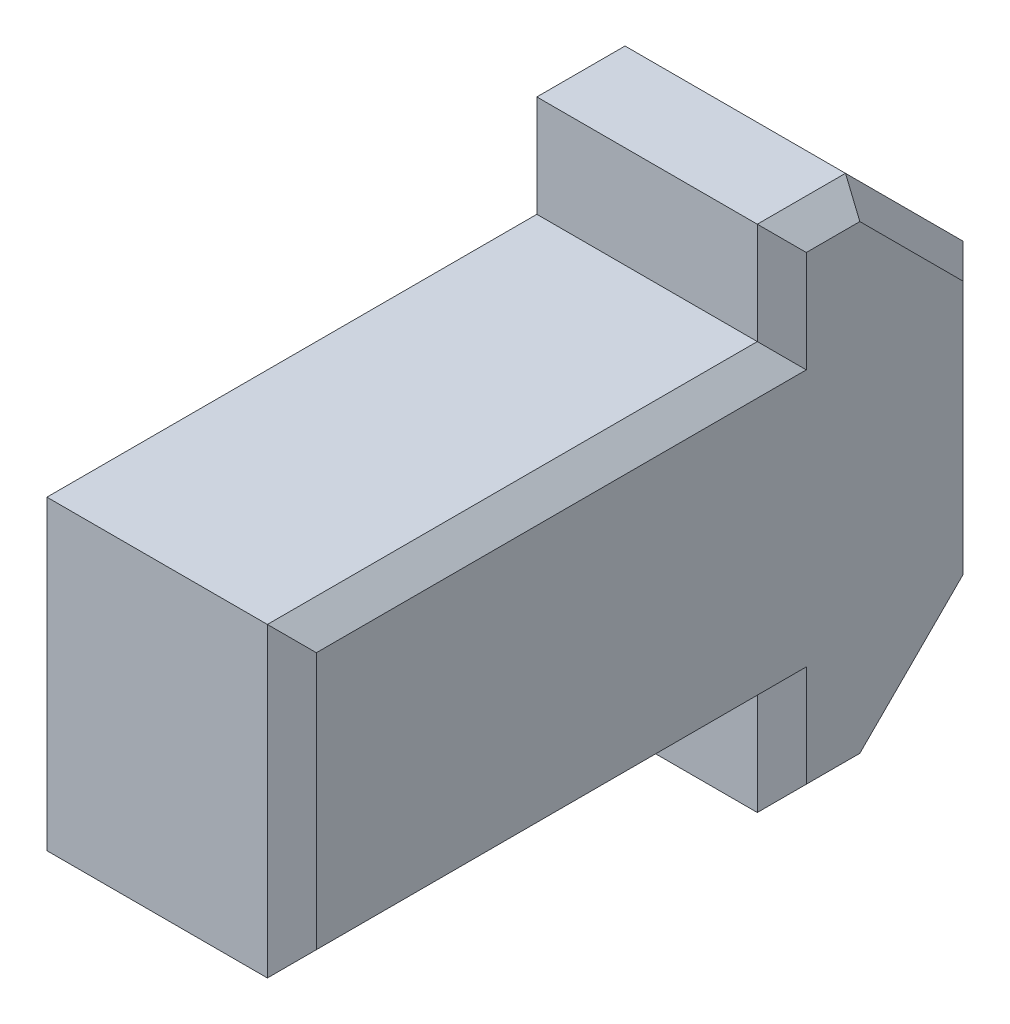
ISO-10303-21;
HEADER;
FILE_DESCRIPTION(('STEP AP214'),'2;1');
FILE_NAME('part.step','',(''),(''),'','','');
FILE_SCHEMA(('AUTOMOTIVE_DESIGN { 1 0 10303 214 1 1 1 1 }'));
ENDSEC;
DATA;
#1=APPLICATION_CONTEXT('core data for automotive mechanical design processes');
#2=APPLICATION_PROTOCOL_DEFINITION('international standard','automotive_design',2000,#1);
#3=PRODUCT_CONTEXT('',#1,'mechanical');
#4=PRODUCT('Part','Part','',(#3));
#5=PRODUCT_RELATED_PRODUCT_CATEGORY('part','',(#4));
#6=PRODUCT_DEFINITION_FORMATION('','',#4);
#7=PRODUCT_DEFINITION_CONTEXT('part definition',#1,'design');
#8=PRODUCT_DEFINITION('design','',#6,#7);
#9=PRODUCT_DEFINITION_SHAPE('','',#8);
#10=(LENGTH_UNIT() NAMED_UNIT(*) SI_UNIT(.MILLI.,.METRE.));
#11=(NAMED_UNIT(*) PLANE_ANGLE_UNIT() SI_UNIT($,.RADIAN.));
#12=(NAMED_UNIT(*) SI_UNIT($,.STERADIAN.) SOLID_ANGLE_UNIT());
#13=UNCERTAINTY_MEASURE_WITH_UNIT(LENGTH_MEASURE(1.E-05),#10,'distance_accuracy_value','');
#14=(GEOMETRIC_REPRESENTATION_CONTEXT(3) GLOBAL_UNCERTAINTY_ASSIGNED_CONTEXT((#13)) GLOBAL_UNIT_ASSIGNED_CONTEXT((#10,
#11,#12)) REPRESENTATION_CONTEXT('',''));
#15=CARTESIAN_POINT('',(0.,0.,0.));
#16=DIRECTION('',(0.,0.,1.));
#17=DIRECTION('',(1.,0.,0.));
#18=AXIS2_PLACEMENT_3D('',#15,#16,#17);
#19=CARTESIAN_POINT('',(5.,3.125,4.2));
#20=DIRECTION('',(0.,0.,-1.));
#21=DIRECTION('',(-1.,0.,0.));
#22=AXIS2_PLACEMENT_3D('',#19,#20,#21);
#23=PLANE('',#22);
#24=DIRECTION('',(-1.,0.,0.));
#25=VECTOR('',#24,1.);
#26=CARTESIAN_POINT('',(5.,3.125,4.2));
#27=LINE('',#26,#25);
#28=CARTESIAN_POINT('',(4.5,3.125,4.2));
#29=VERTEX_POINT('',#28);
#30=CARTESIAN_POINT('',(0.,3.125,4.2));
#31=VERTEX_POINT('',#30);
#32=EDGE_CURVE('E149',#29,#31,#27,.T.);
#33=ORIENTED_EDGE('',*,*,#32,.F.);
#34=DIRECTION('',(0.,1.,0.));
#35=VECTOR('',#34,1.);
#36=CARTESIAN_POINT('',(4.5,3.125,4.2));
#37=LINE('',#36,#35);
#38=CARTESIAN_POINT('',(4.5,5.2,4.2));
#39=VERTEX_POINT('',#38);
#40=EDGE_CURVE('E11',#29,#39,#37,.T.);
#41=ORIENTED_EDGE('',*,*,#40,.T.);
#42=DIRECTION('',(-1.,0.,0.));
#43=VECTOR('',#42,1.);
#44=CARTESIAN_POINT('',(5.,5.2,4.2));
#45=LINE('',#44,#43);
#46=CARTESIAN_POINT('',(0.,5.2,4.2));
#47=VERTEX_POINT('',#46);
#48=EDGE_CURVE('E172',#39,#47,#45,.T.);
#49=ORIENTED_EDGE('',*,*,#48,.T.);
#50=DIRECTION('',(0.,-1.,0.));
#51=VECTOR('',#50,1.);
#52=CARTESIAN_POINT('',(0.,3.125,4.2));
#53=LINE('',#52,#51);
#54=EDGE_CURVE('E165',#47,#31,#53,.T.);
#55=ORIENTED_EDGE('',*,*,#54,.T.);
#56=EDGE_LOOP('',(#33,#41,#49,#55));
#57=FACE_BOUND('',#56,.T.);
#58=ADVANCED_FACE('F41',(#57),#23,.F.);
#59=CARTESIAN_POINT('',(5.,3.125,4.2));
#60=DIRECTION('',(0.,-1.,0.));
#61=DIRECTION('',(0.,0.,-1.));
#62=AXIS2_PLACEMENT_3D('',#59,#60,#61);
#63=PLANE('',#62);
#64=DIRECTION('',(-1.,0.,0.));
#65=VECTOR('',#64,1.);
#66=CARTESIAN_POINT('',(5.,3.125,14.2));
#67=LINE('',#66,#65);
#68=CARTESIAN_POINT('',(4.5,3.125,14.2));
#69=VERTEX_POINT('',#68);
#70=CARTESIAN_POINT('',(0.,3.125,14.2));
#71=VERTEX_POINT('',#70);
#72=EDGE_CURVE('E159',#69,#71,#67,.T.);
#73=ORIENTED_EDGE('',*,*,#72,.F.);
#74=DIRECTION('',(0.,0.,-1.));
#75=VECTOR('',#74,1.);
#76=CARTESIAN_POINT('',(4.5,3.125,4.2));
#77=LINE('',#76,#75);
#78=EDGE_CURVE('E52',#69,#29,#77,.T.);
#79=ORIENTED_EDGE('',*,*,#78,.T.);
#80=ORIENTED_EDGE('',*,*,#32,.T.);
#81=DIRECTION('',(0.,0.,1.));
#82=VECTOR('',#81,1.);
#83=CARTESIAN_POINT('',(0.,3.125,4.2));
#84=LINE('',#83,#82);
#85=EDGE_CURVE('E152',#31,#71,#84,.T.);
#86=ORIENTED_EDGE('',*,*,#85,.T.);
#87=EDGE_LOOP('',(#73,#79,#80,#86));
#88=FACE_BOUND('',#87,.T.);
#89=ADVANCED_FACE('F151',(#88),#63,.F.);
#90=CARTESIAN_POINT('',(5.,3.125,14.2));
#91=DIRECTION('',(0.,0.,-1.));
#92=DIRECTION('',(-1.,0.,0.));
#93=AXIS2_PLACEMENT_3D('',#90,#91,#92);
#94=PLANE('',#93);
#95=DIRECTION('',(-1.,0.,0.));
#96=VECTOR('',#95,1.);
#97=CARTESIAN_POINT('',(5.,-3.125,14.2));
#98=LINE('',#97,#96);
#99=CARTESIAN_POINT('',(4.5,-3.125,14.2));
#100=VERTEX_POINT('',#99);
#101=CARTESIAN_POINT('',(0.,-3.125,14.2));
#102=VERTEX_POINT('',#101);
#103=EDGE_CURVE('E229',#100,#102,#98,.T.);
#104=ORIENTED_EDGE('',*,*,#103,.F.);
#105=DIRECTION('',(0.,1.,0.));
#106=VECTOR('',#105,1.);
#107=CARTESIAN_POINT('',(4.5,3.125,14.2));
#108=LINE('',#107,#106);
#109=EDGE_CURVE('E67',#100,#69,#108,.T.);
#110=ORIENTED_EDGE('',*,*,#109,.T.);
#111=ORIENTED_EDGE('',*,*,#72,.T.);
#112=DIRECTION('',(0.,-1.,0.));
#113=VECTOR('',#112,1.);
#114=CARTESIAN_POINT('',(0.,3.125,14.2));
#115=LINE('',#114,#113);
#116=EDGE_CURVE('E168',#71,#102,#115,.T.);
#117=ORIENTED_EDGE('',*,*,#116,.T.);
#118=EDGE_LOOP('',(#104,#110,#111,#117));
#119=FACE_BOUND('',#118,.T.);
#120=ADVANCED_FACE('F400',(#119),#94,.F.);
#121=CARTESIAN_POINT('',(5.,-3.125,14.2));
#122=DIRECTION('',(0.,1.,0.));
#123=DIRECTION('',(0.,0.,1.));
#124=AXIS2_PLACEMENT_3D('',#121,#122,#123);
#125=PLANE('',#124);
#126=DIRECTION('',(-1.,0.,0.));
#127=VECTOR('',#126,1.);
#128=CARTESIAN_POINT('',(5.,-3.125,4.2));
#129=LINE('',#128,#127);
#130=CARTESIAN_POINT('',(4.5,-3.125,4.2));
#131=VERTEX_POINT('',#130);
#132=CARTESIAN_POINT('',(0.,-3.125,4.2));
#133=VERTEX_POINT('',#132);
#134=EDGE_CURVE('E226',#131,#133,#129,.T.);
#135=ORIENTED_EDGE('',*,*,#134,.F.);
#136=DIRECTION('',(0.,0.,1.));
#137=VECTOR('',#136,1.);
#138=CARTESIAN_POINT('',(4.5,-3.125,14.2));
#139=LINE('',#138,#137);
#140=EDGE_CURVE('E283',#131,#100,#139,.T.);
#141=ORIENTED_EDGE('',*,*,#140,.T.);
#142=ORIENTED_EDGE('',*,*,#103,.T.);
#143=DIRECTION('',(0.,0.,-1.));
#144=VECTOR('',#143,1.);
#145=CARTESIAN_POINT('',(0.,-3.125,14.2));
#146=LINE('',#145,#144);
#147=EDGE_CURVE('E182',#102,#133,#146,.T.);
#148=ORIENTED_EDGE('',*,*,#147,.T.);
#149=EDGE_LOOP('',(#135,#141,#142,#148));
#150=FACE_BOUND('',#149,.T.);
#151=ADVANCED_FACE('F558',(#150),#125,.F.);
#152=CARTESIAN_POINT('',(5.,-3.125,4.2));
#153=DIRECTION('',(0.,0.,-1.));
#154=DIRECTION('',(-1.,0.,0.));
#155=AXIS2_PLACEMENT_3D('',#152,#153,#154);
#156=PLANE('',#155);
#157=DIRECTION('',(-1.,0.,0.));
#158=VECTOR('',#157,1.);
#159=CARTESIAN_POINT('',(5.,-5.2,4.2));
#160=LINE('',#159,#158);
#161=CARTESIAN_POINT('',(4.5,-5.2,4.2));
#162=VERTEX_POINT('',#161);
#163=CARTESIAN_POINT('',(0.,-5.2,4.2));
#164=VERTEX_POINT('',#163);
#165=EDGE_CURVE('E223',#162,#164,#160,.T.);
#166=ORIENTED_EDGE('',*,*,#165,.F.);
#167=DIRECTION('',(0.,1.,0.));
#168=VECTOR('',#167,1.);
#169=CARTESIAN_POINT('',(4.5,-3.125,4.2));
#170=LINE('',#169,#168);
#171=EDGE_CURVE('E280',#162,#131,#170,.T.);
#172=ORIENTED_EDGE('',*,*,#171,.T.);
#173=ORIENTED_EDGE('',*,*,#134,.T.);
#174=DIRECTION('',(0.,-1.,0.));
#175=VECTOR('',#174,1.);
#176=CARTESIAN_POINT('',(0.,-3.125,4.2));
#177=LINE('',#176,#175);
#178=EDGE_CURVE('E186',#133,#164,#177,.T.);
#179=ORIENTED_EDGE('',*,*,#178,.T.);
#180=EDGE_LOOP('',(#166,#172,#173,#179));
#181=FACE_BOUND('',#180,.T.);
#182=ADVANCED_FACE('F550',(#181),#156,.F.);
#183=CARTESIAN_POINT('',(5.,-5.2,4.2));
#184=DIRECTION('',(0.,1.,0.));
#185=DIRECTION('',(0.,0.,1.));
#186=AXIS2_PLACEMENT_3D('',#183,#184,#185);
#187=PLANE('',#186);
#188=DIRECTION('',(-1.,0.,0.));
#189=VECTOR('',#188,1.);
#190=CARTESIAN_POINT('',(5.,-5.2,2.4));
#191=LINE('',#190,#189);
#192=CARTESIAN_POINT('',(4.5,-5.2,2.4));
#193=VERTEX_POINT('',#192);
#194=CARTESIAN_POINT('',(0.,-5.2,2.4));
#195=VERTEX_POINT('',#194);
#196=EDGE_CURVE('E220',#193,#195,#191,.T.);
#197=ORIENTED_EDGE('',*,*,#196,.F.);
#198=DIRECTION('',(0.,0.,1.));
#199=VECTOR('',#198,1.);
#200=CARTESIAN_POINT('',(4.5,-5.2,4.2));
#201=LINE('',#200,#199);
#202=EDGE_CURVE('E277',#193,#162,#201,.T.);
#203=ORIENTED_EDGE('',*,*,#202,.T.);
#204=ORIENTED_EDGE('',*,*,#165,.T.);
#205=DIRECTION('',(0.,0.,-1.));
#206=VECTOR('',#205,1.);
#207=CARTESIAN_POINT('',(0.,-5.2,4.2));
#208=LINE('',#207,#206);
#209=EDGE_CURVE('E190',#164,#195,#208,.T.);
#210=ORIENTED_EDGE('',*,*,#209,.T.);
#211=EDGE_LOOP('',(#197,#203,#204,#210));
#212=FACE_BOUND('',#211,.T.);
#213=ADVANCED_FACE('F382',(#212),#187,.F.);
#214=CARTESIAN_POINT('',(5.,-5.2,2.4));
#215=DIRECTION('',(0.,0.707106781186548,0.707106781186548));
#216=DIRECTION('',(0.,-0.707106781186548,0.707106781186548));
#217=AXIS2_PLACEMENT_3D('',#214,#215,#216);
#218=PLANE('',#217);
#219=DIRECTION('',(-1.,0.,0.));
#220=VECTOR('',#219,1.);
#221=CARTESIAN_POINT('',(5.,-2.8,0.));
#222=LINE('',#221,#220);
#223=CARTESIAN_POINT('',(4.5,-2.8,0.));
#224=VERTEX_POINT('',#223);
#225=CARTESIAN_POINT('',(0.,-2.8,0.));
#226=VERTEX_POINT('',#225);
#227=EDGE_CURVE('E217',#224,#226,#222,.T.);
#228=ORIENTED_EDGE('',*,*,#227,.F.);
#229=DIRECTION('',(0.,-0.707106781186548,0.707106781186548));
#230=VECTOR('',#229,1.);
#231=CARTESIAN_POINT('',(4.5,-5.2,2.4));
#232=LINE('',#231,#230);
#233=EDGE_CURVE('E274',#224,#193,#232,.T.);
#234=ORIENTED_EDGE('',*,*,#233,.T.);
#235=ORIENTED_EDGE('',*,*,#196,.T.);
#236=DIRECTION('',(0.,0.707106781186547,-0.707106781186547));
#237=VECTOR('',#236,1.);
#238=CARTESIAN_POINT('',(0.,-5.2,2.4));
#239=LINE('',#238,#237);
#240=EDGE_CURVE('E194',#195,#226,#239,.T.);
#241=ORIENTED_EDGE('',*,*,#240,.T.);
#242=EDGE_LOOP('',(#228,#234,#235,#241));
#243=FACE_BOUND('',#242,.T.);
#244=ADVANCED_FACE('F379',(#243),#218,.F.);
#245=CARTESIAN_POINT('',(5.,2.8,0.));
#246=DIRECTION('',(0.,0.,1.));
#247=DIRECTION('',(0.,-1.,0.));
#248=AXIS2_PLACEMENT_3D('',#245,#246,#247);
#249=PLANE('',#248);
#250=DIRECTION('',(-1.,0.,0.));
#251=VECTOR('',#250,1.);
#252=CARTESIAN_POINT('',(5.,2.8,0.));
#253=LINE('',#252,#251);
#254=CARTESIAN_POINT('',(4.5,2.8,0.));
#255=VERTEX_POINT('',#254);
#256=CARTESIAN_POINT('',(0.,2.8,0.));
#257=VERTEX_POINT('',#256);
#258=EDGE_CURVE('E214',#255,#257,#253,.T.);
#259=ORIENTED_EDGE('',*,*,#258,.F.);
#260=DIRECTION('',(0.,-1.,0.));
#261=VECTOR('',#260,1.);
#262=CARTESIAN_POINT('',(4.5,2.8,0.));
#263=LINE('',#262,#261);
#264=EDGE_CURVE('E271',#255,#224,#263,.T.);
#265=ORIENTED_EDGE('',*,*,#264,.T.);
#266=ORIENTED_EDGE('',*,*,#227,.T.);
#267=DIRECTION('',(0.,1.,0.));
#268=VECTOR('',#267,1.);
#269=CARTESIAN_POINT('',(0.,2.8,0.));
#270=LINE('',#269,#268);
#271=EDGE_CURVE('E198',#226,#257,#270,.T.);
#272=ORIENTED_EDGE('',*,*,#271,.T.);
#273=EDGE_LOOP('',(#259,#265,#266,#272));
#274=FACE_BOUND('',#273,.T.);
#275=ADVANCED_FACE('F365',(#274),#249,.F.);
#276=CARTESIAN_POINT('',(5.,5.2,2.4));
#277=DIRECTION('',(0.,-0.707106781186548,0.707106781186547));
#278=DIRECTION('',(0.,-0.707106781186547,-0.707106781186548));
#279=AXIS2_PLACEMENT_3D('',#276,#277,#278);
#280=PLANE('',#279);
#281=DIRECTION('',(-1.,0.,0.));
#282=VECTOR('',#281,1.);
#283=CARTESIAN_POINT('',(5.,5.2,2.4));
#284=LINE('',#283,#282);
#285=CARTESIAN_POINT('',(4.5,5.2,2.4));
#286=VERTEX_POINT('',#285);
#287=CARTESIAN_POINT('',(0.,5.2,2.4));
#288=VERTEX_POINT('',#287);
#289=EDGE_CURVE('E211',#286,#288,#284,.T.);
#290=ORIENTED_EDGE('',*,*,#289,.F.);
#291=DIRECTION('',(0.,-0.707106781186547,-0.707106781186548));
#292=VECTOR('',#291,1.);
#293=CARTESIAN_POINT('',(4.5,5.2,2.4));
#294=LINE('',#293,#292);
#295=EDGE_CURVE('E268',#286,#255,#294,.T.);
#296=ORIENTED_EDGE('',*,*,#295,.T.);
#297=ORIENTED_EDGE('',*,*,#258,.T.);
#298=DIRECTION('',(0.,0.707106781186547,0.707106781186548));
#299=VECTOR('',#298,1.);
#300=CARTESIAN_POINT('',(0.,5.2,2.4));
#301=LINE('',#300,#299);
#302=EDGE_CURVE('E202',#257,#288,#301,.T.);
#303=ORIENTED_EDGE('',*,*,#302,.T.);
#304=EDGE_LOOP('',(#290,#296,#297,#303));
#305=FACE_BOUND('',#304,.T.);
#306=ADVANCED_FACE('F362',(#305),#280,.F.);
#307=CARTESIAN_POINT('',(5.,5.2,4.2));
#308=DIRECTION('',(0.,-1.,0.));
#309=DIRECTION('',(0.,0.,-1.));
#310=AXIS2_PLACEMENT_3D('',#307,#308,#309);
#311=PLANE('',#310);
#312=ORIENTED_EDGE('',*,*,#48,.F.);
#313=DIRECTION('',(0.,0.,-1.));
#314=VECTOR('',#313,1.);
#315=CARTESIAN_POINT('',(4.5,5.2,4.2));
#316=LINE('',#315,#314);
#317=EDGE_CURVE('E264',#39,#286,#316,.T.);
#318=ORIENTED_EDGE('',*,*,#317,.T.);
#319=ORIENTED_EDGE('',*,*,#289,.T.);
#320=DIRECTION('',(0.,0.,1.));
#321=VECTOR('',#320,1.);
#322=CARTESIAN_POINT('',(0.,5.2,4.2));
#323=LINE('',#322,#321);
#324=EDGE_CURVE('E206',#288,#47,#323,.T.);
#325=ORIENTED_EDGE('',*,*,#324,.T.);
#326=EDGE_LOOP('',(#312,#318,#319,#325));
#327=FACE_BOUND('',#326,.T.);
#328=ADVANCED_FACE('F349',(#327),#311,.F.);
#329=CARTESIAN_POINT('',(5.,0.,0.));
#330=DIRECTION('',(-1.,0.,0.));
#331=DIRECTION('',(0.,0.,1.));
#332=AXIS2_PLACEMENT_3D('',#329,#330,#331);
#333=PLANE('',#332);
#334=DIRECTION('',(0.,0.707106781186547,0.707106781186548));
#335=VECTOR('',#334,1.);
#336=CARTESIAN_POINT('',(5.,1.04644660940673,-1.04644660940673));
#337=LINE('',#336,#335);
#338=CARTESIAN_POINT('',(5.,2.59289321881345,0.500000000000001));
#339=VERTEX_POINT('',#338);
#340=CARTESIAN_POINT('',(5.,4.7,2.60710678118655));
#341=VERTEX_POINT('',#340);
#342=EDGE_CURVE('E257',#339,#341,#337,.T.);
#343=ORIENTED_EDGE('',*,*,#342,.T.);
#344=DIRECTION('',(0.,0.,1.));
#345=VECTOR('',#344,1.);
#346=CARTESIAN_POINT('',(5.,4.7,0.));
#347=LINE('',#346,#345);
#348=CARTESIAN_POINT('',(5.,4.7,3.7));
#349=VERTEX_POINT('',#348);
#350=EDGE_CURVE('E260',#341,#349,#347,.T.);
#351=ORIENTED_EDGE('',*,*,#350,.T.);
#352=DIRECTION('',(0.,-1.,0.));
#353=VECTOR('',#352,1.);
#354=CARTESIAN_POINT('',(5.,0.,3.7));
#355=LINE('',#354,#353);
#356=CARTESIAN_POINT('',(5.,2.625,3.7));
#357=VERTEX_POINT('',#356);
#358=EDGE_CURVE('E158',#349,#357,#355,.T.);
#359=ORIENTED_EDGE('',*,*,#358,.T.);
#360=DIRECTION('',(0.,0.,1.));
#361=VECTOR('',#360,1.);
#362=CARTESIAN_POINT('',(5.,2.625,0.));
#363=LINE('',#362,#361);
#364=CARTESIAN_POINT('',(5.,2.625,13.7));
#365=VERTEX_POINT('',#364);
#366=EDGE_CURVE('E236',#357,#365,#363,.T.);
#367=ORIENTED_EDGE('',*,*,#366,.T.);
#368=DIRECTION('',(0.,-1.,0.));
#369=VECTOR('',#368,1.);
#370=CARTESIAN_POINT('',(5.,0.,13.7));
#371=LINE('',#370,#369);
#372=CARTESIAN_POINT('',(5.,-2.625,13.7));
#373=VERTEX_POINT('',#372);
#374=EDGE_CURVE('E239',#365,#373,#371,.T.);
#375=ORIENTED_EDGE('',*,*,#374,.T.);
#376=DIRECTION('',(0.,0.,-1.));
#377=VECTOR('',#376,1.);
#378=CARTESIAN_POINT('',(5.,-2.625,0.));
#379=LINE('',#378,#377);
#380=CARTESIAN_POINT('',(5.,-2.625,3.7));
#381=VERTEX_POINT('',#380);
#382=EDGE_CURVE('E242',#373,#381,#379,.T.);
#383=ORIENTED_EDGE('',*,*,#382,.T.);
#384=DIRECTION('',(0.,-1.,0.));
#385=VECTOR('',#384,1.);
#386=CARTESIAN_POINT('',(5.,0.,3.7));
#387=LINE('',#386,#385);
#388=CARTESIAN_POINT('',(5.,-4.7,3.7));
#389=VERTEX_POINT('',#388);
#390=EDGE_CURVE('E245',#381,#389,#387,.T.);
#391=ORIENTED_EDGE('',*,*,#390,.T.);
#392=DIRECTION('',(0.,0.,-1.));
#393=VECTOR('',#392,1.);
#394=CARTESIAN_POINT('',(5.,-4.7,0.));
#395=LINE('',#394,#393);
#396=CARTESIAN_POINT('',(5.,-4.7,2.60710678118655));
#397=VERTEX_POINT('',#396);
#398=EDGE_CURVE('E248',#389,#397,#395,.T.);
#399=ORIENTED_EDGE('',*,*,#398,.T.);
#400=DIRECTION('',(0.,0.707106781186548,-0.707106781186548));
#401=VECTOR('',#400,1.);
#402=CARTESIAN_POINT('',(5.,-1.04644660940673,-1.04644660940673));
#403=LINE('',#402,#401);
#404=CARTESIAN_POINT('',(5.,-2.59289321881345,0.5));
#405=VERTEX_POINT('',#404);
#406=EDGE_CURVE('E251',#397,#405,#403,.T.);
#407=ORIENTED_EDGE('',*,*,#406,.T.);
#408=DIRECTION('',(0.,1.,0.));
#409=VECTOR('',#408,1.);
#410=CARTESIAN_POINT('',(5.,0.,0.500000000000001));
#411=LINE('',#410,#409);
#412=EDGE_CURVE('E254',#405,#339,#411,.T.);
#413=ORIENTED_EDGE('',*,*,#412,.T.);
#414=EDGE_LOOP('',(#343,#351,#359,#367,#375,#383,#391,#399,#407,#413));
#415=FACE_BOUND('',#414,.T.);
#416=ADVANCED_FACE('F333',(#415),#333,.F.);
#417=CARTESIAN_POINT('',(0.,0.,0.));
#418=DIRECTION('',(-1.,0.,0.));
#419=DIRECTION('',(0.,0.,1.));
#420=AXIS2_PLACEMENT_3D('',#417,#418,#419);
#421=PLANE('',#420);
#422=ORIENTED_EDGE('',*,*,#54,.F.);
#423=ORIENTED_EDGE('',*,*,#324,.F.);
#424=ORIENTED_EDGE('',*,*,#302,.F.);
#425=ORIENTED_EDGE('',*,*,#271,.F.);
#426=ORIENTED_EDGE('',*,*,#240,.F.);
#427=ORIENTED_EDGE('',*,*,#209,.F.);
#428=ORIENTED_EDGE('',*,*,#178,.F.);
#429=ORIENTED_EDGE('',*,*,#147,.F.);
#430=ORIENTED_EDGE('',*,*,#116,.F.);
#431=ORIENTED_EDGE('',*,*,#85,.F.);
#432=EDGE_LOOP('',(#422,#423,#424,#425,#426,#427,#428,#429,#430,#431));
#433=FACE_BOUND('',#432,.T.);
#434=ADVANCED_FACE('F163',(#433),#421,.T.);
#435=CARTESIAN_POINT('',(5.,0.,3.7));
#436=DIRECTION('',(-0.707106781186546,0.,-0.707106781186549));
#437=DIRECTION('',(0.,-1.,0.));
#438=AXIS2_PLACEMENT_3D('',#435,#436,#437);
#439=PLANE('',#438);
#440=DIRECTION('',(0.577350269189627,0.577350269189625,-0.577350269189625));
#441=VECTOR('',#440,1.);
#442=CARTESIAN_POINT('',(5.875,-1.75,2.825));
#443=LINE('',#442,#441);
#444=EDGE_CURVE('E178',#131,#381,#443,.T.);
#445=ORIENTED_EDGE('',*,*,#444,.F.);
#446=ORIENTED_EDGE('',*,*,#171,.F.);
#447=DIRECTION('',(0.577350269189627,0.577350269189625,-0.577350269189625));
#448=VECTOR('',#447,1.);
#449=CARTESIAN_POINT('',(6.56666666666667,-3.13333333333334,2.13333333333334));
#450=LINE('',#449,#448);
#451=EDGE_CURVE('E46',#389,#162,#450,.F.);
#452=ORIENTED_EDGE('',*,*,#451,.F.);
#453=ORIENTED_EDGE('',*,*,#390,.F.);
#454=EDGE_LOOP('',(#445,#446,#452,#453));
#455=FACE_BOUND('',#454,.T.);
#456=ADVANCED_FACE('F44',(#455),#439,.F.);
#457=CARTESIAN_POINT('',(5.,-4.7,0.));
#458=DIRECTION('',(-0.707106781186547,0.707106781186549,0.));
#459=DIRECTION('',(0.,0.,-1.));
#460=AXIS2_PLACEMENT_3D('',#457,#458,#459);
#461=PLANE('',#460);
#462=ORIENTED_EDGE('',*,*,#451,.T.);
#463=ORIENTED_EDGE('',*,*,#202,.F.);
#464=DIRECTION('',(0.678598344545848,0.678598344545846,0.28108463771482));
#465=VECTOR('',#464,1.);
#466=CARTESIAN_POINT('',(4.50271114562705,-5.19728885437295,2.40112299328829));
#467=LINE('',#466,#465);
#468=EDGE_CURVE('E316',#397,#193,#467,.F.);
#469=ORIENTED_EDGE('',*,*,#468,.F.);
#470=ORIENTED_EDGE('',*,*,#398,.F.);
#471=EDGE_LOOP('',(#462,#463,#469,#470));
#472=FACE_BOUND('',#471,.T.);
#473=ADVANCED_FACE('F387',(#472),#461,.F.);
#474=CARTESIAN_POINT('',(5.,-2.625,0.));
#475=DIRECTION('',(-0.707106781186546,0.707106781186549,0.));
#476=DIRECTION('',(0.,0.,-1.));
#477=AXIS2_PLACEMENT_3D('',#474,#475,#476);
#478=PLANE('',#477);
#479=ORIENTED_EDGE('',*,*,#444,.T.);
#480=ORIENTED_EDGE('',*,*,#382,.F.);
#481=DIRECTION('',(0.577350269189627,0.577350269189625,-0.577350269189625));
#482=VECTOR('',#481,1.);
#483=CARTESIAN_POINT('',(5.875,-1.75,12.825));
#484=LINE('',#483,#482);
#485=EDGE_CURVE('E312',#100,#373,#484,.T.);
#486=ORIENTED_EDGE('',*,*,#485,.F.);
#487=ORIENTED_EDGE('',*,*,#140,.F.);
#488=EDGE_LOOP('',(#479,#480,#486,#487));
#489=FACE_BOUND('',#488,.T.);
#490=ADVANCED_FACE('F325',(#489),#478,.F.);
#491=CARTESIAN_POINT('',(5.,-1.04644660940673,-1.04644660940673));
#492=DIRECTION('',(-0.707106781186547,0.500000000000001,0.500000000000001));
#493=DIRECTION('',(0.,0.707106781186548,-0.707106781186548));
#494=AXIS2_PLACEMENT_3D('',#491,#492,#493);
#495=PLANE('',#494);
#496=ORIENTED_EDGE('',*,*,#468,.T.);
#497=ORIENTED_EDGE('',*,*,#233,.F.);
#498=DIRECTION('',(0.678598344545848,0.28108463771482,0.678598344545846));
#499=VECTOR('',#498,1.);
#500=CARTESIAN_POINT('',(4.58284271247462,-2.76568542494924,0.0828427124746206));
#501=LINE('',#500,#499);
#502=EDGE_CURVE('E308',#405,#224,#501,.F.);
#503=ORIENTED_EDGE('',*,*,#502,.F.);
#504=ORIENTED_EDGE('',*,*,#406,.F.);
#505=EDGE_LOOP('',(#496,#497,#503,#504));
#506=FACE_BOUND('',#505,.T.);
#507=ADVANCED_FACE('F376',(#506),#495,.F.);
#508=CARTESIAN_POINT('',(5.,0.,13.7));
#509=DIRECTION('',(-0.707106781186546,0.,-0.707106781186549));
#510=DIRECTION('',(0.,-1.,0.));
#511=AXIS2_PLACEMENT_3D('',#508,#509,#510);
#512=PLANE('',#511);
#513=ORIENTED_EDGE('',*,*,#485,.T.);
#514=ORIENTED_EDGE('',*,*,#374,.F.);
#515=DIRECTION('',(0.577350269189627,-0.577350269189625,-0.577350269189625));
#516=VECTOR('',#515,1.);
#517=CARTESIAN_POINT('',(9.56666666666667,-1.94166666666666,9.13333333333334));
#518=LINE('',#517,#516);
#519=EDGE_CURVE('E304',#69,#365,#518,.T.);
#520=ORIENTED_EDGE('',*,*,#519,.F.);
#521=ORIENTED_EDGE('',*,*,#109,.F.);
#522=EDGE_LOOP('',(#513,#514,#520,#521));
#523=FACE_BOUND('',#522,.T.);
#524=ADVANCED_FACE('F339',(#523),#512,.F.);
#525=CARTESIAN_POINT('',(5.,0.,0.500000000000001));
#526=DIRECTION('',(-0.707106781186546,0.,0.707106781186549));
#527=DIRECTION('',(0.,1.,0.));
#528=AXIS2_PLACEMENT_3D('',#525,#526,#527);
#529=PLANE('',#528);
#530=ORIENTED_EDGE('',*,*,#502,.T.);
#531=ORIENTED_EDGE('',*,*,#264,.F.);
#532=DIRECTION('',(0.678598344545848,-0.28108463771482,0.678598344545846));
#533=VECTOR('',#532,1.);
#534=CARTESIAN_POINT('',(5.49457770874589,2.38803242420349,0.994577708745893));
#535=LINE('',#534,#533);
#536=EDGE_CURVE('E300',#339,#255,#535,.F.);
#537=ORIENTED_EDGE('',*,*,#536,.F.);
#538=ORIENTED_EDGE('',*,*,#412,.F.);
#539=EDGE_LOOP('',(#530,#531,#537,#538));
#540=FACE_BOUND('',#539,.T.);
#541=ADVANCED_FACE('F370',(#540),#529,.F.);
#542=CARTESIAN_POINT('',(5.,2.625,0.));
#543=DIRECTION('',(-0.707106781186546,-0.707106781186549,0.));
#544=DIRECTION('',(0.,0.,1.));
#545=AXIS2_PLACEMENT_3D('',#542,#543,#544);
#546=PLANE('',#545);
#547=ORIENTED_EDGE('',*,*,#519,.T.);
#548=ORIENTED_EDGE('',*,*,#366,.F.);
#549=DIRECTION('',(0.577350269189627,-0.577350269189625,-0.577350269189625));
#550=VECTOR('',#549,1.);
#551=CARTESIAN_POINT('',(6.23333333333333,1.39166666666667,2.46666666666667));
#552=LINE('',#551,#550);
#553=EDGE_CURVE('E296',#29,#357,#552,.T.);
#554=ORIENTED_EDGE('',*,*,#553,.F.);
#555=ORIENTED_EDGE('',*,*,#78,.F.);
#556=EDGE_LOOP('',(#547,#548,#554,#555));
#557=FACE_BOUND('',#556,.T.);
#558=ADVANCED_FACE('F341',(#557),#546,.F.);
#559=CARTESIAN_POINT('',(5.,1.04644660940673,-1.04644660940673));
#560=DIRECTION('',(-0.707106781186546,-0.500000000000001,0.500000000000001));
#561=DIRECTION('',(0.,0.707106781186547,0.707106781186548));
#562=AXIS2_PLACEMENT_3D('',#559,#560,#561);
#563=PLANE('',#562);
#564=ORIENTED_EDGE('',*,*,#536,.T.);
#565=ORIENTED_EDGE('',*,*,#295,.F.);
#566=DIRECTION('',(0.678598344545849,-0.678598344545846,0.28108463771482));
#567=VECTOR('',#566,1.);
#568=CARTESIAN_POINT('',(5.98555385810167,3.71444614189833,3.01533655566139));
#569=LINE('',#568,#567);
#570=EDGE_CURVE('E293',#341,#286,#569,.F.);
#571=ORIENTED_EDGE('',*,*,#570,.F.);
#572=ORIENTED_EDGE('',*,*,#342,.F.);
#573=EDGE_LOOP('',(#564,#565,#571,#572));
#574=FACE_BOUND('',#573,.T.);
#575=ADVANCED_FACE('F358',(#574),#563,.F.);
#576=CARTESIAN_POINT('',(5.,0.,3.7));
#577=DIRECTION('',(-0.707106781186546,0.,-0.707106781186549));
#578=DIRECTION('',(0.,-1.,0.));
#579=AXIS2_PLACEMENT_3D('',#576,#577,#578);
#580=PLANE('',#579);
#581=ORIENTED_EDGE('',*,*,#553,.T.);
#582=ORIENTED_EDGE('',*,*,#358,.F.);
#583=DIRECTION('',(-0.577350269189627,0.577350269189625,0.577350269189625));
#584=VECTOR('',#583,1.);
#585=CARTESIAN_POINT('',(6.56666666666667,3.13333333333334,2.13333333333334));
#586=LINE('',#585,#584);
#587=EDGE_CURVE('E290',#39,#349,#586,.F.);
#588=ORIENTED_EDGE('',*,*,#587,.F.);
#589=ORIENTED_EDGE('',*,*,#40,.F.);
#590=EDGE_LOOP('',(#581,#582,#588,#589));
#591=FACE_BOUND('',#590,.T.);
#592=ADVANCED_FACE('F346',(#591),#580,.F.);
#593=CARTESIAN_POINT('',(5.,4.7,0.));
#594=DIRECTION('',(-0.707106781186546,-0.707106781186549,0.));
#595=DIRECTION('',(0.,0.,1.));
#596=AXIS2_PLACEMENT_3D('',#593,#594,#595);
#597=PLANE('',#596);
#598=ORIENTED_EDGE('',*,*,#570,.T.);
#599=ORIENTED_EDGE('',*,*,#317,.F.);
#600=ORIENTED_EDGE('',*,*,#587,.T.);
#601=ORIENTED_EDGE('',*,*,#350,.F.);
#602=EDGE_LOOP('',(#598,#599,#600,#601));
#603=FACE_BOUND('',#602,.T.);
#604=ADVANCED_FACE('F352',(#603),#597,.F.);
#605=CLOSED_SHELL('',(#58,#89,#120,#151,#182,#213,#244,#275,#306,#328,#416,#434,#456,#473,#490,
#507,#524,#541,#558,#575,#592,#604));
#606=MANIFOLD_SOLID_BREP('B2',#605);
#607=ADVANCED_BREP_SHAPE_REPRESENTATION('',(#18,#606),#14);
#608=SHAPE_DEFINITION_REPRESENTATION(#9,#607);
ENDSEC;
END-ISO-10303-21;
